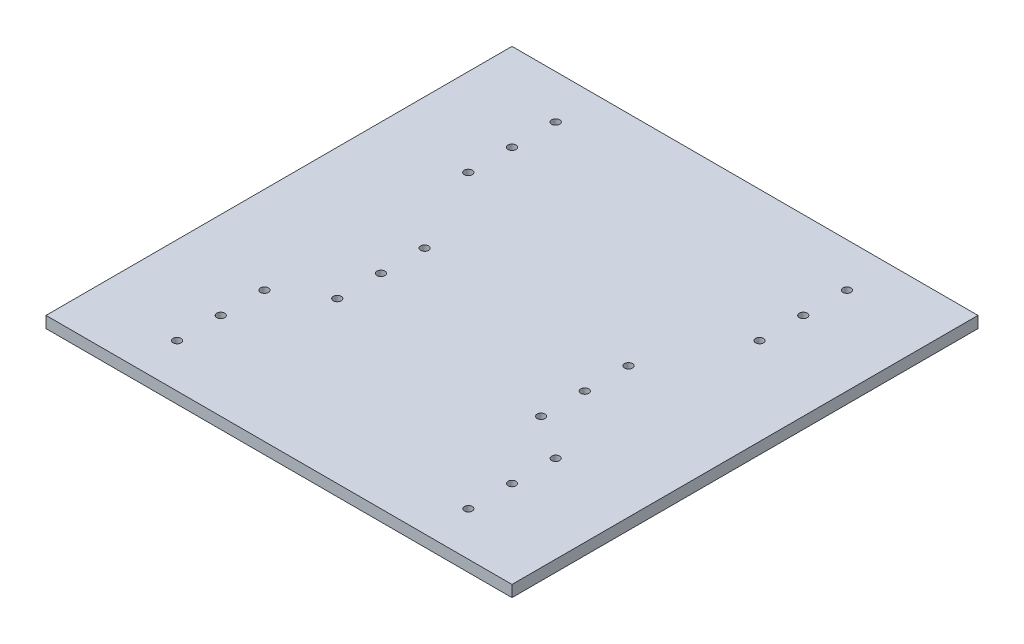
ISO-10303-21;
HEADER;
FILE_DESCRIPTION(('STEP AP214'),'2;1');
FILE_NAME('part.step','',(''),(''),'','','');
FILE_SCHEMA(('AUTOMOTIVE_DESIGN { 1 0 10303 214 1 1 1 1 }'));
ENDSEC;
DATA;
#1=APPLICATION_CONTEXT('core data for automotive mechanical design processes');
#2=APPLICATION_PROTOCOL_DEFINITION('international standard','automotive_design',2000,#1);
#3=PRODUCT_CONTEXT('',#1,'mechanical');
#4=PRODUCT('Part','Part','',(#3));
#5=PRODUCT_RELATED_PRODUCT_CATEGORY('part','',(#4));
#6=PRODUCT_DEFINITION_FORMATION('','',#4);
#7=PRODUCT_DEFINITION_CONTEXT('part definition',#1,'design');
#8=PRODUCT_DEFINITION('design','',#6,#7);
#9=PRODUCT_DEFINITION_SHAPE('','',#8);
#10=(LENGTH_UNIT() NAMED_UNIT(*) SI_UNIT(.MILLI.,.METRE.));
#11=(NAMED_UNIT(*) PLANE_ANGLE_UNIT() SI_UNIT($,.RADIAN.));
#12=(NAMED_UNIT(*) SI_UNIT($,.STERADIAN.) SOLID_ANGLE_UNIT());
#13=UNCERTAINTY_MEASURE_WITH_UNIT(LENGTH_MEASURE(1.E-05),#10,'distance_accuracy_value','');
#14=(GEOMETRIC_REPRESENTATION_CONTEXT(3) GLOBAL_UNCERTAINTY_ASSIGNED_CONTEXT((#13)) GLOBAL_UNIT_ASSIGNED_CONTEXT((#10,
#11,#12)) REPRESENTATION_CONTEXT('',''));
#15=CARTESIAN_POINT('',(0.,0.,0.));
#16=DIRECTION('',(0.,0.,1.));
#17=DIRECTION('',(1.,0.,0.));
#18=AXIS2_PLACEMENT_3D('',#15,#16,#17);
#19=CARTESIAN_POINT('',(0.,4.99999,0.));
#20=DIRECTION('',(0.,-1.,0.));
#21=DIRECTION('',(0.,0.,-1.));
#22=AXIS2_PLACEMENT_3D('',#19,#20,#21);
#23=PLANE('',#22);
#24=CARTESIAN_POINT('',(-44.45,4.99999,12.7));
#25=DIRECTION('',(0.,1.,0.));
#26=DIRECTION('',(0.,0.,1.));
#27=AXIS2_PLACEMENT_3D('',#24,#25,#26);
#28=CIRCLE('',#27,1.72719999999998);
#29=CARTESIAN_POINT('',(-44.45,4.99999,14.4272));
#30=VERTEX_POINT('',#29);
#31=EDGE_CURVE('E213',#30,#30,#28,.T.);
#32=ORIENTED_EDGE('',*,*,#31,.F.);
#33=EDGE_LOOP('',(#32));
#34=FACE_BOUND('',#33,.T.);
#35=CARTESIAN_POINT('',(44.45,4.99999,31.75));
#36=DIRECTION('',(0.,1.,0.));
#37=DIRECTION('',(0.,0.,1.));
#38=AXIS2_PLACEMENT_3D('',#35,#36,#37);
#39=CIRCLE('',#38,1.72719999999999);
#40=CARTESIAN_POINT('',(44.45,4.99999,33.4771999999999));
#41=VERTEX_POINT('',#40);
#42=EDGE_CURVE('E201',#41,#41,#39,.T.);
#43=ORIENTED_EDGE('',*,*,#42,.F.);
#44=EDGE_LOOP('',(#43));
#45=FACE_BOUND('',#44,.T.);
#46=CARTESIAN_POINT('',(44.45,4.99999,-6.35000000000004));
#47=DIRECTION('',(0.,1.,0.));
#48=DIRECTION('',(0.,0.,1.));
#49=AXIS2_PLACEMENT_3D('',#46,#47,#48);
#50=CIRCLE('',#49,1.72719999999999);
#51=CARTESIAN_POINT('',(44.45,4.99999,-4.62280000000005));
#52=VERTEX_POINT('',#51);
#53=EDGE_CURVE('E189',#52,#52,#50,.T.);
#54=ORIENTED_EDGE('',*,*,#53,.F.);
#55=EDGE_LOOP('',(#54));
#56=FACE_BOUND('',#55,.T.);
#57=CARTESIAN_POINT('',(-63.5,4.99999,63.5));
#58=DIRECTION('',(0.,1.,0.));
#59=DIRECTION('',(0.,0.,1.));
#60=AXIS2_PLACEMENT_3D('',#57,#58,#59);
#61=CIRCLE('',#60,1.72719999999998);
#62=CARTESIAN_POINT('',(-63.5,4.99999,65.2272));
#63=VERTEX_POINT('',#62);
#64=EDGE_CURVE('E177',#63,#63,#61,.T.);
#65=ORIENTED_EDGE('',*,*,#64,.F.);
#66=EDGE_LOOP('',(#65));
#67=FACE_BOUND('',#66,.T.);
#68=CARTESIAN_POINT('',(63.4999999999999,4.99999,44.45));
#69=DIRECTION('',(0.,1.,0.));
#70=DIRECTION('',(0.,0.,1.));
#71=AXIS2_PLACEMENT_3D('',#68,#69,#70);
#72=CIRCLE('',#71,1.72719999999998);
#73=CARTESIAN_POINT('',(63.4999999999999,4.99999,46.1772));
#74=VERTEX_POINT('',#73);
#75=EDGE_CURVE('E165',#74,#74,#72,.T.);
#76=ORIENTED_EDGE('',*,*,#75,.F.);
#77=EDGE_LOOP('',(#76));
#78=FACE_BOUND('',#77,.T.);
#79=CARTESIAN_POINT('',(63.4999999999999,4.99999,82.55));
#80=DIRECTION('',(0.,1.,0.));
#81=DIRECTION('',(0.,0.,1.));
#82=AXIS2_PLACEMENT_3D('',#79,#80,#81);
#83=CIRCLE('',#82,1.72719999999998);
#84=CARTESIAN_POINT('',(63.4999999999999,4.99999,84.2772));
#85=VERTEX_POINT('',#84);
#86=EDGE_CURVE('E159',#85,#85,#83,.T.);
#87=ORIENTED_EDGE('',*,*,#86,.F.);
#88=EDGE_LOOP('',(#87));
#89=FACE_BOUND('',#88,.T.);
#90=DIRECTION('',(0.,0.,-1.));
#91=VECTOR('',#90,1.);
#92=CARTESIAN_POINT('',(101.6,4.99999,101.6));
#93=LINE('',#92,#91);
#94=CARTESIAN_POINT('',(101.6,4.99999,101.6));
#95=VERTEX_POINT('',#94);
#96=CARTESIAN_POINT('',(101.6,4.99999,-101.6));
#97=VERTEX_POINT('',#96);
#98=EDGE_CURVE('E89',#95,#97,#93,.T.);
#99=ORIENTED_EDGE('',*,*,#98,.T.);
#100=DIRECTION('',(-1.,0.,0.));
#101=VECTOR('',#100,1.);
#102=CARTESIAN_POINT('',(-101.6,4.99999,-101.6));
#103=LINE('',#102,#101);
#104=CARTESIAN_POINT('',(-101.6,4.99999,-101.6));
#105=VERTEX_POINT('',#104);
#106=EDGE_CURVE('E84',#97,#105,#103,.T.);
#107=ORIENTED_EDGE('',*,*,#106,.T.);
#108=DIRECTION('',(0.,0.,1.));
#109=VECTOR('',#108,1.);
#110=CARTESIAN_POINT('',(-101.6,4.99999,101.6));
#111=LINE('',#110,#109);
#112=CARTESIAN_POINT('',(-101.6,4.99999,101.6));
#113=VERTEX_POINT('',#112);
#114=EDGE_CURVE('E87',#105,#113,#111,.T.);
#115=ORIENTED_EDGE('',*,*,#114,.T.);
#116=DIRECTION('',(1.,0.,0.));
#117=VECTOR('',#116,1.);
#118=CARTESIAN_POINT('',(-101.6,4.99999,101.6));
#119=LINE('',#118,#117);
#120=EDGE_CURVE('E54',#113,#95,#119,.T.);
#121=ORIENTED_EDGE('',*,*,#120,.T.);
#122=EDGE_LOOP('',(#99,#107,#115,#121));
#123=FACE_BOUND('',#122,.T.);
#124=CARTESIAN_POINT('',(-63.5,4.99999,-82.55));
#125=DIRECTION('',(0.,1.,0.));
#126=DIRECTION('',(0.,0.,1.));
#127=AXIS2_PLACEMENT_3D('',#124,#125,#126);
#128=CIRCLE('',#127,1.72719999999998);
#129=CARTESIAN_POINT('',(-63.5,4.99999,-80.8228));
#130=VERTEX_POINT('',#129);
#131=EDGE_CURVE('E117',#130,#130,#128,.T.);
#132=ORIENTED_EDGE('',*,*,#131,.F.);
#133=EDGE_LOOP('',(#132));
#134=FACE_BOUND('',#133,.T.);
#135=CARTESIAN_POINT('',(-63.5,4.99999,-63.5));
#136=DIRECTION('',(0.,1.,0.));
#137=DIRECTION('',(0.,0.,1.));
#138=AXIS2_PLACEMENT_3D('',#135,#136,#137);
#139=CIRCLE('',#138,1.72719999999998);
#140=CARTESIAN_POINT('',(-63.5,4.99999,-61.7728));
#141=VERTEX_POINT('',#140);
#142=EDGE_CURVE('E123',#141,#141,#139,.T.);
#143=ORIENTED_EDGE('',*,*,#142,.F.);
#144=EDGE_LOOP('',(#143));
#145=FACE_BOUND('',#144,.T.);
#146=CARTESIAN_POINT('',(-63.5,4.99999,-44.45));
#147=DIRECTION('',(0.,1.,0.));
#148=DIRECTION('',(0.,0.,1.));
#149=AXIS2_PLACEMENT_3D('',#146,#147,#148);
#150=CIRCLE('',#149,1.72719999999998);
#151=CARTESIAN_POINT('',(-63.5,4.99999,-42.7228));
#152=VERTEX_POINT('',#151);
#153=EDGE_CURVE('E129',#152,#152,#150,.T.);
#154=ORIENTED_EDGE('',*,*,#153,.F.);
#155=EDGE_LOOP('',(#154));
#156=FACE_BOUND('',#155,.T.);
#157=CARTESIAN_POINT('',(63.5,4.99999,-44.45));
#158=DIRECTION('',(0.,1.,0.));
#159=DIRECTION('',(0.,0.,1.));
#160=AXIS2_PLACEMENT_3D('',#157,#158,#159);
#161=CIRCLE('',#160,1.72719999999998);
#162=CARTESIAN_POINT('',(63.5,4.99999,-42.7228));
#163=VERTEX_POINT('',#162);
#164=EDGE_CURVE('E135',#163,#163,#161,.T.);
#165=ORIENTED_EDGE('',*,*,#164,.F.);
#166=EDGE_LOOP('',(#165));
#167=FACE_BOUND('',#166,.T.);
#168=CARTESIAN_POINT('',(63.5,4.99999,-63.5));
#169=DIRECTION('',(0.,1.,0.));
#170=DIRECTION('',(0.,0.,1.));
#171=AXIS2_PLACEMENT_3D('',#168,#169,#170);
#172=CIRCLE('',#171,1.72719999999998);
#173=CARTESIAN_POINT('',(63.5,4.99999,-61.7728));
#174=VERTEX_POINT('',#173);
#175=EDGE_CURVE('E141',#174,#174,#172,.T.);
#176=ORIENTED_EDGE('',*,*,#175,.F.);
#177=EDGE_LOOP('',(#176));
#178=FACE_BOUND('',#177,.T.);
#179=CARTESIAN_POINT('',(63.5,4.99999,-82.55));
#180=DIRECTION('',(0.,1.,0.));
#181=DIRECTION('',(0.,0.,1.));
#182=AXIS2_PLACEMENT_3D('',#179,#180,#181);
#183=CIRCLE('',#182,1.72719999999998);
#184=CARTESIAN_POINT('',(63.5,4.99999,-80.8228));
#185=VERTEX_POINT('',#184);
#186=EDGE_CURVE('E147',#185,#185,#183,.T.);
#187=ORIENTED_EDGE('',*,*,#186,.F.);
#188=EDGE_LOOP('',(#187));
#189=FACE_BOUND('',#188,.T.);
#190=CARTESIAN_POINT('',(63.4999999999999,4.99999,63.5));
#191=DIRECTION('',(0.,1.,0.));
#192=DIRECTION('',(0.,0.,1.));
#193=AXIS2_PLACEMENT_3D('',#190,#191,#192);
#194=CIRCLE('',#193,1.72719999999998);
#195=CARTESIAN_POINT('',(63.4999999999999,4.99999,65.2272));
#196=VERTEX_POINT('',#195);
#197=EDGE_CURVE('E153',#196,#196,#194,.T.);
#198=ORIENTED_EDGE('',*,*,#197,.F.);
#199=EDGE_LOOP('',(#198));
#200=FACE_BOUND('',#199,.T.);
#201=CARTESIAN_POINT('',(-63.5,4.99999,82.55));
#202=DIRECTION('',(0.,1.,0.));
#203=DIRECTION('',(0.,0.,1.));
#204=AXIS2_PLACEMENT_3D('',#201,#202,#203);
#205=CIRCLE('',#204,1.72719999999998);
#206=CARTESIAN_POINT('',(-63.5,4.99999,84.2772));
#207=VERTEX_POINT('',#206);
#208=EDGE_CURVE('E171',#207,#207,#205,.T.);
#209=ORIENTED_EDGE('',*,*,#208,.F.);
#210=EDGE_LOOP('',(#209));
#211=FACE_BOUND('',#210,.T.);
#212=CARTESIAN_POINT('',(-63.5,4.99999,44.45));
#213=DIRECTION('',(0.,1.,0.));
#214=DIRECTION('',(0.,0.,1.));
#215=AXIS2_PLACEMENT_3D('',#212,#213,#214);
#216=CIRCLE('',#215,1.72719999999998);
#217=CARTESIAN_POINT('',(-63.5,4.99999,46.1772));
#218=VERTEX_POINT('',#217);
#219=EDGE_CURVE('E183',#218,#218,#216,.T.);
#220=ORIENTED_EDGE('',*,*,#219,.F.);
#221=EDGE_LOOP('',(#220));
#222=FACE_BOUND('',#221,.T.);
#223=CARTESIAN_POINT('',(44.45,4.99999,12.7));
#224=DIRECTION('',(0.,1.,0.));
#225=DIRECTION('',(0.,0.,1.));
#226=AXIS2_PLACEMENT_3D('',#223,#224,#225);
#227=CIRCLE('',#226,1.72719999999999);
#228=CARTESIAN_POINT('',(44.45,4.99999,14.4271999999999));
#229=VERTEX_POINT('',#228);
#230=EDGE_CURVE('E195',#229,#229,#227,.T.);
#231=ORIENTED_EDGE('',*,*,#230,.F.);
#232=EDGE_LOOP('',(#231));
#233=FACE_BOUND('',#232,.T.);
#234=CARTESIAN_POINT('',(-44.45,4.99999,31.75));
#235=DIRECTION('',(0.,1.,0.));
#236=DIRECTION('',(0.,0.,1.));
#237=AXIS2_PLACEMENT_3D('',#234,#235,#236);
#238=CIRCLE('',#237,1.72719999999998);
#239=CARTESIAN_POINT('',(-44.45,4.99999,33.4771999999999));
#240=VERTEX_POINT('',#239);
#241=EDGE_CURVE('E207',#240,#240,#238,.T.);
#242=ORIENTED_EDGE('',*,*,#241,.F.);
#243=EDGE_LOOP('',(#242));
#244=FACE_BOUND('',#243,.T.);
#245=CARTESIAN_POINT('',(-44.45,4.99999,-6.35000000000004));
#246=DIRECTION('',(0.,1.,0.));
#247=DIRECTION('',(0.,0.,1.));
#248=AXIS2_PLACEMENT_3D('',#245,#246,#247);
#249=CIRCLE('',#248,1.72719999999998);
#250=CARTESIAN_POINT('',(-44.45,4.99999,-4.62280000000005));
#251=VERTEX_POINT('',#250);
#252=EDGE_CURVE('E219',#251,#251,#249,.T.);
#253=ORIENTED_EDGE('',*,*,#252,.F.);
#254=EDGE_LOOP('',(#253));
#255=FACE_BOUND('',#254,.T.);
#256=ADVANCED_FACE('F37',(#34,#45,#56,#67,#78,#89,#123,#134,#145,#156,#167,#178,#189,#200,#211,
#222,#233,#244,#255),#23,.F.);
#257=CARTESIAN_POINT('',(101.6,4.99999,101.6));
#258=DIRECTION('',(-1.,0.,0.));
#259=DIRECTION('',(0.,0.,1.));
#260=AXIS2_PLACEMENT_3D('',#257,#258,#259);
#261=PLANE('',#260);
#262=DIRECTION('',(0.,0.,-1.));
#263=VECTOR('',#262,1.);
#264=CARTESIAN_POINT('',(101.6,0.,101.6));
#265=LINE('',#264,#263);
#266=CARTESIAN_POINT('',(101.6,0.,101.6));
#267=VERTEX_POINT('',#266);
#268=CARTESIAN_POINT('',(101.6,0.,-101.6));
#269=VERTEX_POINT('',#268);
#270=EDGE_CURVE('E101',#267,#269,#265,.T.);
#271=ORIENTED_EDGE('',*,*,#270,.T.);
#272=DIRECTION('',(0.,-1.,0.));
#273=VECTOR('',#272,1.);
#274=CARTESIAN_POINT('',(101.6,4.99999,-101.6));
#275=LINE('',#274,#273);
#276=EDGE_CURVE('E11',#97,#269,#275,.T.);
#277=ORIENTED_EDGE('',*,*,#276,.F.);
#278=ORIENTED_EDGE('',*,*,#98,.F.);
#279=DIRECTION('',(0.,-1.,0.));
#280=VECTOR('',#279,1.);
#281=CARTESIAN_POINT('',(101.6,4.99999,101.6));
#282=LINE('',#281,#280);
#283=EDGE_CURVE('E97',#95,#267,#282,.T.);
#284=ORIENTED_EDGE('',*,*,#283,.T.);
#285=EDGE_LOOP('',(#271,#277,#278,#284));
#286=FACE_BOUND('',#285,.T.);
#287=ADVANCED_FACE('F39',(#286),#261,.F.);
#288=CARTESIAN_POINT('',(-101.6,4.99999,-101.6));
#289=DIRECTION('',(0.,0.,1.));
#290=DIRECTION('',(1.,0.,0.));
#291=AXIS2_PLACEMENT_3D('',#288,#289,#290);
#292=PLANE('',#291);
#293=DIRECTION('',(-1.,0.,0.));
#294=VECTOR('',#293,1.);
#295=CARTESIAN_POINT('',(-101.6,0.,-101.6));
#296=LINE('',#295,#294);
#297=CARTESIAN_POINT('',(-101.6,0.,-101.6));
#298=VERTEX_POINT('',#297);
#299=EDGE_CURVE('E93',#269,#298,#296,.T.);
#300=ORIENTED_EDGE('',*,*,#299,.T.);
#301=DIRECTION('',(0.,-1.,0.));
#302=VECTOR('',#301,1.);
#303=CARTESIAN_POINT('',(-101.6,4.99999,-101.6));
#304=LINE('',#303,#302);
#305=EDGE_CURVE('E46',#105,#298,#304,.T.);
#306=ORIENTED_EDGE('',*,*,#305,.F.);
#307=ORIENTED_EDGE('',*,*,#106,.F.);
#308=ORIENTED_EDGE('',*,*,#276,.T.);
#309=EDGE_LOOP('',(#300,#306,#307,#308));
#310=FACE_BOUND('',#309,.T.);
#311=ADVANCED_FACE('F92',(#310),#292,.F.);
#312=CARTESIAN_POINT('',(-101.6,4.99999,101.6));
#313=DIRECTION('',(1.,0.,0.));
#314=DIRECTION('',(0.,0.,-1.));
#315=AXIS2_PLACEMENT_3D('',#312,#313,#314);
#316=PLANE('',#315);
#317=DIRECTION('',(0.,0.,1.));
#318=VECTOR('',#317,1.);
#319=CARTESIAN_POINT('',(-101.6,0.,101.6));
#320=LINE('',#319,#318);
#321=CARTESIAN_POINT('',(-101.6,0.,101.6));
#322=VERTEX_POINT('',#321);
#323=EDGE_CURVE('E71',#298,#322,#320,.T.);
#324=ORIENTED_EDGE('',*,*,#323,.T.);
#325=DIRECTION('',(0.,-1.,0.));
#326=VECTOR('',#325,1.);
#327=CARTESIAN_POINT('',(-101.6,4.99999,101.6));
#328=LINE('',#327,#326);
#329=EDGE_CURVE('E94',#113,#322,#328,.T.);
#330=ORIENTED_EDGE('',*,*,#329,.F.);
#331=ORIENTED_EDGE('',*,*,#114,.F.);
#332=ORIENTED_EDGE('',*,*,#305,.T.);
#333=EDGE_LOOP('',(#324,#330,#331,#332));
#334=FACE_BOUND('',#333,.T.);
#335=ADVANCED_FACE('F95',(#334),#316,.F.);
#336=CARTESIAN_POINT('',(-101.6,4.99999,101.6));
#337=DIRECTION('',(0.,0.,-1.));
#338=DIRECTION('',(-1.,0.,0.));
#339=AXIS2_PLACEMENT_3D('',#336,#337,#338);
#340=PLANE('',#339);
#341=DIRECTION('',(1.,0.,0.));
#342=VECTOR('',#341,1.);
#343=CARTESIAN_POINT('',(-101.6,0.,101.6));
#344=LINE('',#343,#342);
#345=EDGE_CURVE('E77',#322,#267,#344,.T.);
#346=ORIENTED_EDGE('',*,*,#345,.T.);
#347=ORIENTED_EDGE('',*,*,#283,.F.);
#348=ORIENTED_EDGE('',*,*,#120,.F.);
#349=ORIENTED_EDGE('',*,*,#329,.T.);
#350=EDGE_LOOP('',(#346,#347,#348,#349));
#351=FACE_BOUND('',#350,.T.);
#352=ADVANCED_FACE('F109',(#351),#340,.F.);
#353=CARTESIAN_POINT('',(0.,0.,0.));
#354=DIRECTION('',(0.,-1.,0.));
#355=DIRECTION('',(0.,0.,-1.));
#356=AXIS2_PLACEMENT_3D('',#353,#354,#355);
#357=PLANE('',#356);
#358=CARTESIAN_POINT('',(-44.45,0.,-6.35000000000004));
#359=DIRECTION('',(0.,-1.,0.));
#360=DIRECTION('',(0.,0.,-1.));
#361=AXIS2_PLACEMENT_3D('',#358,#359,#360);
#362=CIRCLE('',#361,1.72719999999999);
#363=CARTESIAN_POINT('',(-44.45,0.,-8.07720000000003));
#364=VERTEX_POINT('',#363);
#365=EDGE_CURVE('E216',#364,#364,#362,.T.);
#366=ORIENTED_EDGE('',*,*,#365,.F.);
#367=EDGE_LOOP('',(#366));
#368=FACE_BOUND('',#367,.T.);
#369=CARTESIAN_POINT('',(-44.45,0.,12.7));
#370=DIRECTION('',(0.,-1.,0.));
#371=DIRECTION('',(0.,0.,-1.));
#372=AXIS2_PLACEMENT_3D('',#369,#370,#371);
#373=CIRCLE('',#372,1.72719999999999);
#374=CARTESIAN_POINT('',(-44.45,0.,10.9728));
#375=VERTEX_POINT('',#374);
#376=EDGE_CURVE('E210',#375,#375,#373,.T.);
#377=ORIENTED_EDGE('',*,*,#376,.F.);
#378=EDGE_LOOP('',(#377));
#379=FACE_BOUND('',#378,.T.);
#380=CARTESIAN_POINT('',(-44.45,0.,31.75));
#381=DIRECTION('',(0.,-1.,0.));
#382=DIRECTION('',(0.,0.,-1.));
#383=AXIS2_PLACEMENT_3D('',#380,#381,#382);
#384=CIRCLE('',#383,1.72719999999999);
#385=CARTESIAN_POINT('',(-44.45,0.,30.0228));
#386=VERTEX_POINT('',#385);
#387=EDGE_CURVE('E204',#386,#386,#384,.T.);
#388=ORIENTED_EDGE('',*,*,#387,.F.);
#389=EDGE_LOOP('',(#388));
#390=FACE_BOUND('',#389,.T.);
#391=CARTESIAN_POINT('',(44.45,0.,31.75));
#392=DIRECTION('',(0.,-1.,0.));
#393=DIRECTION('',(0.,0.,-1.));
#394=AXIS2_PLACEMENT_3D('',#391,#392,#393);
#395=CIRCLE('',#394,1.72719999999999);
#396=CARTESIAN_POINT('',(44.45,0.,30.0228));
#397=VERTEX_POINT('',#396);
#398=EDGE_CURVE('E198',#397,#397,#395,.T.);
#399=ORIENTED_EDGE('',*,*,#398,.F.);
#400=EDGE_LOOP('',(#399));
#401=FACE_BOUND('',#400,.T.);
#402=CARTESIAN_POINT('',(44.45,0.,12.7));
#403=DIRECTION('',(0.,-1.,0.));
#404=DIRECTION('',(0.,0.,-1.));
#405=AXIS2_PLACEMENT_3D('',#402,#403,#404);
#406=CIRCLE('',#405,1.72719999999999);
#407=CARTESIAN_POINT('',(44.45,0.,10.9728));
#408=VERTEX_POINT('',#407);
#409=EDGE_CURVE('E192',#408,#408,#406,.T.);
#410=ORIENTED_EDGE('',*,*,#409,.F.);
#411=EDGE_LOOP('',(#410));
#412=FACE_BOUND('',#411,.T.);
#413=CARTESIAN_POINT('',(44.45,0.,-6.35000000000004));
#414=DIRECTION('',(0.,-1.,0.));
#415=DIRECTION('',(0.,0.,-1.));
#416=AXIS2_PLACEMENT_3D('',#413,#414,#415);
#417=CIRCLE('',#416,1.72719999999999);
#418=CARTESIAN_POINT('',(44.45,0.,-8.07720000000004));
#419=VERTEX_POINT('',#418);
#420=EDGE_CURVE('E186',#419,#419,#417,.T.);
#421=ORIENTED_EDGE('',*,*,#420,.F.);
#422=EDGE_LOOP('',(#421));
#423=FACE_BOUND('',#422,.T.);
#424=CARTESIAN_POINT('',(-63.5,0.,44.45));
#425=DIRECTION('',(0.,-1.,0.));
#426=DIRECTION('',(0.,0.,-1.));
#427=AXIS2_PLACEMENT_3D('',#424,#425,#426);
#428=CIRCLE('',#427,1.72719999999999);
#429=CARTESIAN_POINT('',(-63.5,0.,42.7228));
#430=VERTEX_POINT('',#429);
#431=EDGE_CURVE('E180',#430,#430,#428,.T.);
#432=ORIENTED_EDGE('',*,*,#431,.F.);
#433=EDGE_LOOP('',(#432));
#434=FACE_BOUND('',#433,.T.);
#435=CARTESIAN_POINT('',(-63.5,0.,63.5));
#436=DIRECTION('',(0.,-1.,0.));
#437=DIRECTION('',(0.,0.,-1.));
#438=AXIS2_PLACEMENT_3D('',#435,#436,#437);
#439=CIRCLE('',#438,1.72719999999999);
#440=CARTESIAN_POINT('',(-63.5,0.,61.7728));
#441=VERTEX_POINT('',#440);
#442=EDGE_CURVE('E174',#441,#441,#439,.T.);
#443=ORIENTED_EDGE('',*,*,#442,.F.);
#444=EDGE_LOOP('',(#443));
#445=FACE_BOUND('',#444,.T.);
#446=CARTESIAN_POINT('',(-63.5,0.,82.55));
#447=DIRECTION('',(0.,-1.,0.));
#448=DIRECTION('',(0.,0.,-1.));
#449=AXIS2_PLACEMENT_3D('',#446,#447,#448);
#450=CIRCLE('',#449,1.72719999999999);
#451=CARTESIAN_POINT('',(-63.5,0.,80.8228));
#452=VERTEX_POINT('',#451);
#453=EDGE_CURVE('E168',#452,#452,#450,.T.);
#454=ORIENTED_EDGE('',*,*,#453,.F.);
#455=EDGE_LOOP('',(#454));
#456=FACE_BOUND('',#455,.T.);
#457=CARTESIAN_POINT('',(63.4999999999999,0.,44.45));
#458=DIRECTION('',(0.,-1.,0.));
#459=DIRECTION('',(0.,0.,-1.));
#460=AXIS2_PLACEMENT_3D('',#457,#458,#459);
#461=CIRCLE('',#460,1.72719999999999);
#462=CARTESIAN_POINT('',(63.4999999999999,0.,42.7228));
#463=VERTEX_POINT('',#462);
#464=EDGE_CURVE('E162',#463,#463,#461,.T.);
#465=ORIENTED_EDGE('',*,*,#464,.F.);
#466=EDGE_LOOP('',(#465));
#467=FACE_BOUND('',#466,.T.);
#468=CARTESIAN_POINT('',(63.4999999999999,0.,82.55));
#469=DIRECTION('',(0.,-1.,0.));
#470=DIRECTION('',(0.,0.,-1.));
#471=AXIS2_PLACEMENT_3D('',#468,#469,#470);
#472=CIRCLE('',#471,1.72719999999999);
#473=CARTESIAN_POINT('',(63.4999999999999,0.,80.8228));
#474=VERTEX_POINT('',#473);
#475=EDGE_CURVE('E156',#474,#474,#472,.T.);
#476=ORIENTED_EDGE('',*,*,#475,.F.);
#477=EDGE_LOOP('',(#476));
#478=FACE_BOUND('',#477,.T.);
#479=CARTESIAN_POINT('',(63.4999999999999,0.,63.5));
#480=DIRECTION('',(0.,-1.,0.));
#481=DIRECTION('',(0.,0.,-1.));
#482=AXIS2_PLACEMENT_3D('',#479,#480,#481);
#483=CIRCLE('',#482,1.72719999999999);
#484=CARTESIAN_POINT('',(63.4999999999999,0.,61.7728));
#485=VERTEX_POINT('',#484);
#486=EDGE_CURVE('E150',#485,#485,#483,.T.);
#487=ORIENTED_EDGE('',*,*,#486,.F.);
#488=EDGE_LOOP('',(#487));
#489=FACE_BOUND('',#488,.T.);
#490=CARTESIAN_POINT('',(63.5,0.,-82.55));
#491=DIRECTION('',(0.,-1.,0.));
#492=DIRECTION('',(0.,0.,-1.));
#493=AXIS2_PLACEMENT_3D('',#490,#491,#492);
#494=CIRCLE('',#493,1.72719999999999);
#495=CARTESIAN_POINT('',(63.5,0.,-84.2772));
#496=VERTEX_POINT('',#495);
#497=EDGE_CURVE('E144',#496,#496,#494,.T.);
#498=ORIENTED_EDGE('',*,*,#497,.F.);
#499=EDGE_LOOP('',(#498));
#500=FACE_BOUND('',#499,.T.);
#501=CARTESIAN_POINT('',(63.5,0.,-63.5));
#502=DIRECTION('',(0.,-1.,0.));
#503=DIRECTION('',(0.,0.,-1.));
#504=AXIS2_PLACEMENT_3D('',#501,#502,#503);
#505=CIRCLE('',#504,1.72719999999999);
#506=CARTESIAN_POINT('',(63.5,0.,-65.2272));
#507=VERTEX_POINT('',#506);
#508=EDGE_CURVE('E138',#507,#507,#505,.T.);
#509=ORIENTED_EDGE('',*,*,#508,.F.);
#510=EDGE_LOOP('',(#509));
#511=FACE_BOUND('',#510,.T.);
#512=CARTESIAN_POINT('',(63.5,0.,-44.45));
#513=DIRECTION('',(0.,-1.,0.));
#514=DIRECTION('',(0.,0.,-1.));
#515=AXIS2_PLACEMENT_3D('',#512,#513,#514);
#516=CIRCLE('',#515,1.72719999999999);
#517=CARTESIAN_POINT('',(63.5,0.,-46.1772));
#518=VERTEX_POINT('',#517);
#519=EDGE_CURVE('E132',#518,#518,#516,.T.);
#520=ORIENTED_EDGE('',*,*,#519,.F.);
#521=EDGE_LOOP('',(#520));
#522=FACE_BOUND('',#521,.T.);
#523=CARTESIAN_POINT('',(-63.5,0.,-44.45));
#524=DIRECTION('',(0.,-1.,0.));
#525=DIRECTION('',(0.,0.,-1.));
#526=AXIS2_PLACEMENT_3D('',#523,#524,#525);
#527=CIRCLE('',#526,1.72719999999999);
#528=CARTESIAN_POINT('',(-63.5,0.,-46.1772));
#529=VERTEX_POINT('',#528);
#530=EDGE_CURVE('E126',#529,#529,#527,.T.);
#531=ORIENTED_EDGE('',*,*,#530,.F.);
#532=EDGE_LOOP('',(#531));
#533=FACE_BOUND('',#532,.T.);
#534=CARTESIAN_POINT('',(-63.5,0.,-63.5));
#535=DIRECTION('',(0.,-1.,0.));
#536=DIRECTION('',(0.,0.,-1.));
#537=AXIS2_PLACEMENT_3D('',#534,#535,#536);
#538=CIRCLE('',#537,1.72719999999999);
#539=CARTESIAN_POINT('',(-63.5,0.,-65.2272));
#540=VERTEX_POINT('',#539);
#541=EDGE_CURVE('E120',#540,#540,#538,.T.);
#542=ORIENTED_EDGE('',*,*,#541,.F.);
#543=EDGE_LOOP('',(#542));
#544=FACE_BOUND('',#543,.T.);
#545=CARTESIAN_POINT('',(-63.5,0.,-82.55));
#546=DIRECTION('',(0.,-1.,0.));
#547=DIRECTION('',(0.,0.,-1.));
#548=AXIS2_PLACEMENT_3D('',#545,#546,#547);
#549=CIRCLE('',#548,1.72719999999999);
#550=CARTESIAN_POINT('',(-63.5,0.,-84.2772));
#551=VERTEX_POINT('',#550);
#552=EDGE_CURVE('E104',#551,#551,#549,.T.);
#553=ORIENTED_EDGE('',*,*,#552,.F.);
#554=EDGE_LOOP('',(#553));
#555=FACE_BOUND('',#554,.T.);
#556=ORIENTED_EDGE('',*,*,#270,.F.);
#557=ORIENTED_EDGE('',*,*,#345,.F.);
#558=ORIENTED_EDGE('',*,*,#323,.F.);
#559=ORIENTED_EDGE('',*,*,#299,.F.);
#560=EDGE_LOOP('',(#556,#557,#558,#559));
#561=FACE_BOUND('',#560,.T.);
#562=ADVANCED_FACE('F112',(#368,#379,#390,#401,#412,#423,#434,#445,#456,#467,#478,#489,#500,
#511,#522,#533,#544,#555,#561),#357,.T.);
#563=CARTESIAN_POINT('',(-63.5,4.99999,-82.55));
#564=DIRECTION('',(0.,1.,0.));
#565=DIRECTION('',(0.,0.,1.));
#566=AXIS2_PLACEMENT_3D('',#563,#564,#565);
#567=CYLINDRICAL_SURFACE('',#566,1.72719999999999);
#568=ORIENTED_EDGE('',*,*,#131,.T.);
#569=EDGE_LOOP('',(#568));
#570=FACE_BOUND('',#569,.T.);
#571=ORIENTED_EDGE('',*,*,#552,.T.);
#572=EDGE_LOOP('',(#571));
#573=FACE_BOUND('',#572,.T.);
#574=ADVANCED_FACE('F237',(#570,#573),#567,.F.);
#575=CARTESIAN_POINT('',(-63.5,4.99999,-63.5));
#576=DIRECTION('',(0.,1.,0.));
#577=DIRECTION('',(0.,0.,1.));
#578=AXIS2_PLACEMENT_3D('',#575,#576,#577);
#579=CYLINDRICAL_SURFACE('',#578,1.72719999999999);
#580=ORIENTED_EDGE('',*,*,#142,.T.);
#581=EDGE_LOOP('',(#580));
#582=FACE_BOUND('',#581,.T.);
#583=ORIENTED_EDGE('',*,*,#541,.T.);
#584=EDGE_LOOP('',(#583));
#585=FACE_BOUND('',#584,.T.);
#586=ADVANCED_FACE('F276',(#582,#585),#579,.F.);
#587=CARTESIAN_POINT('',(-63.5,4.99999,-44.45));
#588=DIRECTION('',(0.,1.,0.));
#589=DIRECTION('',(0.,0.,1.));
#590=AXIS2_PLACEMENT_3D('',#587,#588,#589);
#591=CYLINDRICAL_SURFACE('',#590,1.72719999999999);
#592=ORIENTED_EDGE('',*,*,#153,.T.);
#593=EDGE_LOOP('',(#592));
#594=FACE_BOUND('',#593,.T.);
#595=ORIENTED_EDGE('',*,*,#530,.T.);
#596=EDGE_LOOP('',(#595));
#597=FACE_BOUND('',#596,.T.);
#598=ADVANCED_FACE('F282',(#594,#597),#591,.F.);
#599=CARTESIAN_POINT('',(63.5,4.99999,-44.45));
#600=DIRECTION('',(0.,1.,0.));
#601=DIRECTION('',(0.,0.,1.));
#602=AXIS2_PLACEMENT_3D('',#599,#600,#601);
#603=CYLINDRICAL_SURFACE('',#602,1.72719999999999);
#604=ORIENTED_EDGE('',*,*,#164,.T.);
#605=EDGE_LOOP('',(#604));
#606=FACE_BOUND('',#605,.T.);
#607=ORIENTED_EDGE('',*,*,#519,.T.);
#608=EDGE_LOOP('',(#607));
#609=FACE_BOUND('',#608,.T.);
#610=ADVANCED_FACE('F289',(#606,#609),#603,.F.);
#611=CARTESIAN_POINT('',(63.5,4.99999,-63.5));
#612=DIRECTION('',(0.,1.,0.));
#613=DIRECTION('',(0.,0.,1.));
#614=AXIS2_PLACEMENT_3D('',#611,#612,#613);
#615=CYLINDRICAL_SURFACE('',#614,1.72719999999999);
#616=ORIENTED_EDGE('',*,*,#175,.T.);
#617=EDGE_LOOP('',(#616));
#618=FACE_BOUND('',#617,.T.);
#619=ORIENTED_EDGE('',*,*,#508,.T.);
#620=EDGE_LOOP('',(#619));
#621=FACE_BOUND('',#620,.T.);
#622=ADVANCED_FACE('F297',(#618,#621),#615,.F.);
#623=CARTESIAN_POINT('',(63.5,4.99999,-82.55));
#624=DIRECTION('',(0.,1.,0.));
#625=DIRECTION('',(0.,0.,1.));
#626=AXIS2_PLACEMENT_3D('',#623,#624,#625);
#627=CYLINDRICAL_SURFACE('',#626,1.72719999999999);
#628=ORIENTED_EDGE('',*,*,#186,.T.);
#629=EDGE_LOOP('',(#628));
#630=FACE_BOUND('',#629,.T.);
#631=ORIENTED_EDGE('',*,*,#497,.T.);
#632=EDGE_LOOP('',(#631));
#633=FACE_BOUND('',#632,.T.);
#634=ADVANCED_FACE('F305',(#630,#633),#627,.F.);
#635=CARTESIAN_POINT('',(63.4999999999999,4.99999,63.5));
#636=DIRECTION('',(0.,1.,0.));
#637=DIRECTION('',(0.,0.,1.));
#638=AXIS2_PLACEMENT_3D('',#635,#636,#637);
#639=CYLINDRICAL_SURFACE('',#638,1.72719999999999);
#640=ORIENTED_EDGE('',*,*,#197,.T.);
#641=EDGE_LOOP('',(#640));
#642=FACE_BOUND('',#641,.T.);
#643=ORIENTED_EDGE('',*,*,#486,.T.);
#644=EDGE_LOOP('',(#643));
#645=FACE_BOUND('',#644,.T.);
#646=ADVANCED_FACE('F313',(#642,#645),#639,.F.);
#647=CARTESIAN_POINT('',(63.4999999999999,4.99999,82.55));
#648=DIRECTION('',(0.,1.,0.));
#649=DIRECTION('',(0.,0.,1.));
#650=AXIS2_PLACEMENT_3D('',#647,#648,#649);
#651=CYLINDRICAL_SURFACE('',#650,1.72719999999999);
#652=ORIENTED_EDGE('',*,*,#86,.T.);
#653=EDGE_LOOP('',(#652));
#654=FACE_BOUND('',#653,.T.);
#655=ORIENTED_EDGE('',*,*,#475,.T.);
#656=EDGE_LOOP('',(#655));
#657=FACE_BOUND('',#656,.T.);
#658=ADVANCED_FACE('F321',(#654,#657),#651,.F.);
#659=CARTESIAN_POINT('',(63.4999999999999,4.99999,44.45));
#660=DIRECTION('',(0.,1.,0.));
#661=DIRECTION('',(0.,0.,1.));
#662=AXIS2_PLACEMENT_3D('',#659,#660,#661);
#663=CYLINDRICAL_SURFACE('',#662,1.72719999999999);
#664=ORIENTED_EDGE('',*,*,#75,.T.);
#665=EDGE_LOOP('',(#664));
#666=FACE_BOUND('',#665,.T.);
#667=ORIENTED_EDGE('',*,*,#464,.T.);
#668=EDGE_LOOP('',(#667));
#669=FACE_BOUND('',#668,.T.);
#670=ADVANCED_FACE('F329',(#666,#669),#663,.F.);
#671=CARTESIAN_POINT('',(-63.5,4.99999,82.55));
#672=DIRECTION('',(0.,1.,0.));
#673=DIRECTION('',(0.,0.,1.));
#674=AXIS2_PLACEMENT_3D('',#671,#672,#673);
#675=CYLINDRICAL_SURFACE('',#674,1.72719999999999);
#676=ORIENTED_EDGE('',*,*,#208,.T.);
#677=EDGE_LOOP('',(#676));
#678=FACE_BOUND('',#677,.T.);
#679=ORIENTED_EDGE('',*,*,#453,.T.);
#680=EDGE_LOOP('',(#679));
#681=FACE_BOUND('',#680,.T.);
#682=ADVANCED_FACE('F337',(#678,#681),#675,.F.);
#683=CARTESIAN_POINT('',(-63.5,4.99999,63.5));
#684=DIRECTION('',(0.,1.,0.));
#685=DIRECTION('',(0.,0.,1.));
#686=AXIS2_PLACEMENT_3D('',#683,#684,#685);
#687=CYLINDRICAL_SURFACE('',#686,1.72719999999999);
#688=ORIENTED_EDGE('',*,*,#64,.T.);
#689=EDGE_LOOP('',(#688));
#690=FACE_BOUND('',#689,.T.);
#691=ORIENTED_EDGE('',*,*,#442,.T.);
#692=EDGE_LOOP('',(#691));
#693=FACE_BOUND('',#692,.T.);
#694=ADVANCED_FACE('F345',(#690,#693),#687,.F.);
#695=CARTESIAN_POINT('',(-63.5,4.99999,44.45));
#696=DIRECTION('',(0.,1.,0.));
#697=DIRECTION('',(0.,0.,1.));
#698=AXIS2_PLACEMENT_3D('',#695,#696,#697);
#699=CYLINDRICAL_SURFACE('',#698,1.72719999999999);
#700=ORIENTED_EDGE('',*,*,#219,.T.);
#701=EDGE_LOOP('',(#700));
#702=FACE_BOUND('',#701,.T.);
#703=ORIENTED_EDGE('',*,*,#431,.T.);
#704=EDGE_LOOP('',(#703));
#705=FACE_BOUND('',#704,.T.);
#706=ADVANCED_FACE('F353',(#702,#705),#699,.F.);
#707=CARTESIAN_POINT('',(44.45,4.99999,-6.35000000000004));
#708=DIRECTION('',(0.,1.,0.));
#709=DIRECTION('',(0.,0.,1.));
#710=AXIS2_PLACEMENT_3D('',#707,#708,#709);
#711=CYLINDRICAL_SURFACE('',#710,1.72719999999999);
#712=ORIENTED_EDGE('',*,*,#53,.T.);
#713=EDGE_LOOP('',(#712));
#714=FACE_BOUND('',#713,.T.);
#715=ORIENTED_EDGE('',*,*,#420,.T.);
#716=EDGE_LOOP('',(#715));
#717=FACE_BOUND('',#716,.T.);
#718=ADVANCED_FACE('F361',(#714,#717),#711,.F.);
#719=CARTESIAN_POINT('',(44.45,4.99999,12.7));
#720=DIRECTION('',(0.,1.,0.));
#721=DIRECTION('',(0.,0.,1.));
#722=AXIS2_PLACEMENT_3D('',#719,#720,#721);
#723=CYLINDRICAL_SURFACE('',#722,1.72719999999999);
#724=ORIENTED_EDGE('',*,*,#230,.T.);
#725=EDGE_LOOP('',(#724));
#726=FACE_BOUND('',#725,.T.);
#727=ORIENTED_EDGE('',*,*,#409,.T.);
#728=EDGE_LOOP('',(#727));
#729=FACE_BOUND('',#728,.T.);
#730=ADVANCED_FACE('F369',(#726,#729),#723,.F.);
#731=CARTESIAN_POINT('',(44.45,4.99999,31.75));
#732=DIRECTION('',(0.,1.,0.));
#733=DIRECTION('',(0.,0.,1.));
#734=AXIS2_PLACEMENT_3D('',#731,#732,#733);
#735=CYLINDRICAL_SURFACE('',#734,1.72719999999999);
#736=ORIENTED_EDGE('',*,*,#42,.T.);
#737=EDGE_LOOP('',(#736));
#738=FACE_BOUND('',#737,.T.);
#739=ORIENTED_EDGE('',*,*,#398,.T.);
#740=EDGE_LOOP('',(#739));
#741=FACE_BOUND('',#740,.T.);
#742=ADVANCED_FACE('F377',(#738,#741),#735,.F.);
#743=CARTESIAN_POINT('',(-44.45,4.99999,31.75));
#744=DIRECTION('',(0.,1.,0.));
#745=DIRECTION('',(0.,0.,1.));
#746=AXIS2_PLACEMENT_3D('',#743,#744,#745);
#747=CYLINDRICAL_SURFACE('',#746,1.72719999999999);
#748=ORIENTED_EDGE('',*,*,#241,.T.);
#749=EDGE_LOOP('',(#748));
#750=FACE_BOUND('',#749,.T.);
#751=ORIENTED_EDGE('',*,*,#387,.T.);
#752=EDGE_LOOP('',(#751));
#753=FACE_BOUND('',#752,.T.);
#754=ADVANCED_FACE('F385',(#750,#753),#747,.F.);
#755=CARTESIAN_POINT('',(-44.45,4.99999,12.7));
#756=DIRECTION('',(0.,1.,0.));
#757=DIRECTION('',(0.,0.,1.));
#758=AXIS2_PLACEMENT_3D('',#755,#756,#757);
#759=CYLINDRICAL_SURFACE('',#758,1.72719999999999);
#760=ORIENTED_EDGE('',*,*,#31,.T.);
#761=EDGE_LOOP('',(#760));
#762=FACE_BOUND('',#761,.T.);
#763=ORIENTED_EDGE('',*,*,#376,.T.);
#764=EDGE_LOOP('',(#763));
#765=FACE_BOUND('',#764,.T.);
#766=ADVANCED_FACE('F393',(#762,#765),#759,.F.);
#767=CARTESIAN_POINT('',(-44.45,4.99999,-6.35000000000004));
#768=DIRECTION('',(0.,1.,0.));
#769=DIRECTION('',(0.,0.,1.));
#770=AXIS2_PLACEMENT_3D('',#767,#768,#769);
#771=CYLINDRICAL_SURFACE('',#770,1.72719999999999);
#772=ORIENTED_EDGE('',*,*,#252,.T.);
#773=EDGE_LOOP('',(#772));
#774=FACE_BOUND('',#773,.T.);
#775=ORIENTED_EDGE('',*,*,#365,.T.);
#776=EDGE_LOOP('',(#775));
#777=FACE_BOUND('',#776,.T.);
#778=ADVANCED_FACE('F223',(#774,#777),#771,.F.);
#779=CLOSED_SHELL('',(#256,#287,#311,#335,#352,#562,#574,#586,#598,#610,#622,#634,#646,#658,
#670,#682,#694,#706,#718,#730,#742,#754,#766,#778));
#780=MANIFOLD_SOLID_BREP('B2',#779);
#781=ADVANCED_BREP_SHAPE_REPRESENTATION('',(#18,#780),#14);
#782=SHAPE_DEFINITION_REPRESENTATION(#9,#781);
ENDSEC;
END-ISO-10303-21;
